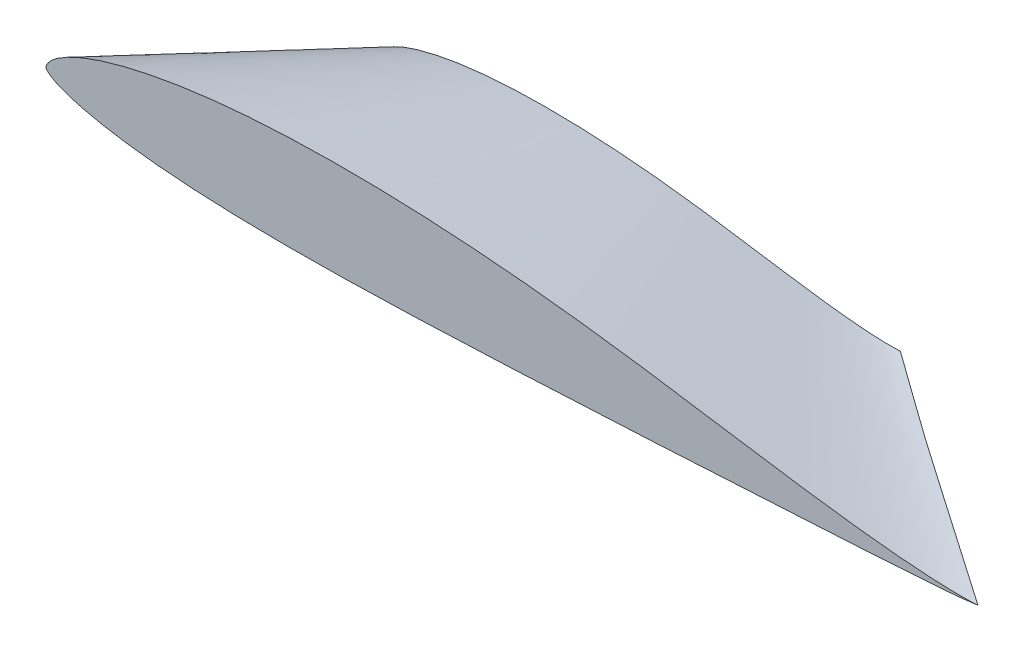
ISO-10303-21;
HEADER;
FILE_DESCRIPTION(('STEP AP214'),'2;1');
FILE_NAME('part.step','',(''),(''),'','','');
FILE_SCHEMA(('AUTOMOTIVE_DESIGN { 1 0 10303 214 1 1 1 1 }'));
ENDSEC;
DATA;
#1=APPLICATION_CONTEXT('core data for automotive mechanical design processes');
#2=APPLICATION_PROTOCOL_DEFINITION('international standard','automotive_design',2000,#1);
#3=PRODUCT_CONTEXT('',#1,'mechanical');
#4=PRODUCT('Part','Part','',(#3));
#5=PRODUCT_RELATED_PRODUCT_CATEGORY('part','',(#4));
#6=PRODUCT_DEFINITION_FORMATION('','',#4);
#7=PRODUCT_DEFINITION_CONTEXT('part definition',#1,'design');
#8=PRODUCT_DEFINITION('design','',#6,#7);
#9=PRODUCT_DEFINITION_SHAPE('','',#8);
#10=(LENGTH_UNIT() NAMED_UNIT(*) SI_UNIT(.MILLI.,.METRE.));
#11=(NAMED_UNIT(*) PLANE_ANGLE_UNIT() SI_UNIT($,.RADIAN.));
#12=(NAMED_UNIT(*) SI_UNIT($,.STERADIAN.) SOLID_ANGLE_UNIT());
#13=UNCERTAINTY_MEASURE_WITH_UNIT(LENGTH_MEASURE(1.E-05),#10,'distance_accuracy_value','');
#14=(GEOMETRIC_REPRESENTATION_CONTEXT(3) GLOBAL_UNCERTAINTY_ASSIGNED_CONTEXT((#13)) GLOBAL_UNIT_ASSIGNED_CONTEXT((#10,
#11,#12)) REPRESENTATION_CONTEXT('',''));
#15=CARTESIAN_POINT('',(0.,0.,0.));
#16=DIRECTION('',(0.,0.,1.));
#17=DIRECTION('',(1.,0.,0.));
#18=AXIS2_PLACEMENT_3D('',#15,#16,#17);
#19=CARTESIAN_POINT('',(30.2126309390007,0.496199434898217,-35.));
#20=DIRECTION('',(0.,0.,-1.));
#21=DIRECTION('',(-1.,0.,0.));
#22=AXIS2_PLACEMENT_3D('',#19,#20,#21);
#23=PLANE('',#22);
#24=CARTESIAN_POINT('',(130.,0.,-35.));
#25=CARTESIAN_POINT('',(130.00284789565,0.00436198396944594,-35.));
#26=CARTESIAN_POINT('',(129.264936884486,-0.0543685600533196,-35.));
#27=CARTESIAN_POINT('',(128.514883284143,-0.0615944404420271,-35.));
#28=CARTESIAN_POINT('',(126.665331110606,-0.0587012388051691,-35.));
#29=CARTESIAN_POINT('',(124.410933682827,0.0581220334944895,-35.));
#30=CARTESIAN_POINT('',(121.493467377831,0.269864385451097,-35.));
#31=CARTESIAN_POINT('',(118.105633906202,0.612549148797999,-35.));
#32=CARTESIAN_POINT('',(114.27710981908,1.08234417076237,-35.));
#33=CARTESIAN_POINT('',(110.100426454593,1.66298451666062,-35.));
#34=CARTESIAN_POINT('',(105.646399101114,2.32926773346608,-35.));
#35=CARTESIAN_POINT('',(100.988713756714,3.05044859428628,-35.));
#36=CARTESIAN_POINT('',(96.1912335998851,3.78738347959371,-35.));
#37=CARTESIAN_POINT('',(91.3034770934868,4.48631205322438,-35.));
#38=CARTESIAN_POINT('',(86.3659618800243,5.1111373225283,-35.));
#39=CARTESIAN_POINT('',(81.4147412229501,5.64233245600475,-35.));
#40=CARTESIAN_POINT('',(76.4865376925869,6.06423980380676,-35.));
#41=CARTESIAN_POINT('',(71.620309212033,6.37124623773558,-35.));
#42=CARTESIAN_POINT('',(66.8566860279294,6.55886386660355,-35.));
#43=CARTESIAN_POINT('',(62.2377738326016,6.62633701613077,-35.));
#44=CARTESIAN_POINT('',(57.8048246655033,6.57328124374517,-35.));
#45=CARTESIAN_POINT('',(53.596729110453,6.39723781459766,-35.));
#46=CARTESIAN_POINT('',(49.6483327049328,6.10107140817271,-35.));
#47=CARTESIAN_POINT('',(45.9901109935646,5.68886435633574,-35.));
#48=CARTESIAN_POINT('',(42.6500380657126,5.17157831450558,-35.));
#49=CARTESIAN_POINT('',(39.6540325132396,4.57049858588213,-35.));
#50=CARTESIAN_POINT('',(37.0277052938856,3.90377983939044,-35.));
#51=CARTESIAN_POINT('',(34.7947185905219,3.1889045347254,-35.));
#52=CARTESIAN_POINT('',(32.9723264209415,2.44661058109185,-35.));
#53=CARTESIAN_POINT('',(31.5754938918139,1.70179811629576,-35.));
#54=CARTESIAN_POINT('',(30.6954271435269,1.05605031948798,-35.));
#55=CARTESIAN_POINT('',(30.2676784454324,0.586361007537532,-35.));
#56=CARTESIAN_POINT('',(30.1050785638683,0.335884265336202,-35.));
#57=CARTESIAN_POINT('',(30.0321517577068,0.175463978344724,-35.));
#58=CARTESIAN_POINT('',(29.9990927415483,0.0475705023075208,-35.));
#59=CARTESIAN_POINT('',(29.9976531894444,-0.0547294381762267,-35.));
#60=CARTESIAN_POINT('',(30.0410130703702,-0.14975181611273,-35.));
#61=CARTESIAN_POINT('',(30.1267998635964,-0.261239222686654,-35.));
#62=CARTESIAN_POINT('',(30.2671091001079,-0.393801006228457,-35.));
#63=CARTESIAN_POINT('',(30.5186271837772,-0.580346826699614,-35.));
#64=CARTESIAN_POINT('',(31.1152712342459,-0.936386608830139,-35.));
#65=CARTESIAN_POINT('',(32.2448776844307,-1.38899131087983,-35.));
#66=CARTESIAN_POINT('',(33.9738438510731,-1.89354833009926,-35.));
#67=CARTESIAN_POINT('',(36.1649829708852,-2.36692774507717,-35.));
#68=CARTESIAN_POINT('',(38.7948587323147,-2.78813354873596,-35.));
#69=CARTESIAN_POINT('',(41.843733542726,-3.13907498168399,-35.));
#70=CARTESIAN_POINT('',(45.2883872085152,-3.40733295579013,-35.));
#71=CARTESIAN_POINT('',(49.1029168523231,-3.59045872977425,-35.));
#72=CARTESIAN_POINT('',(53.2568281178687,-3.68578548605587,-35.));
#73=CARTESIAN_POINT('',(57.715221363267,-3.6980653177991,-35.));
#74=CARTESIAN_POINT('',(62.4381255026303,-3.63283350838669,-35.));
#75=CARTESIAN_POINT('',(67.380381843639,-3.50334491964719,-35.));
#76=CARTESIAN_POINT('',(72.4909150946084,-3.32019326593179,-35.));
#77=CARTESIAN_POINT('',(77.7135132531714,-3.09970731985851,-35.));
#78=CARTESIAN_POINT('',(82.9875907566283,-2.85210491461414,-35.));
#79=CARTESIAN_POINT('',(88.2500745436281,-2.58967771178085,-35.));
#80=CARTESIAN_POINT('',(93.4369687551809,-2.31921217355746,-35.));
#81=CARTESIAN_POINT('',(98.4849063244687,-2.04894048388516,-35.));
#82=CARTESIAN_POINT('',(103.332198378719,-1.7825051981847,-35.));
#83=CARTESIAN_POINT('',(107.919823623481,-1.52559007974668,-35.));
#84=CARTESIAN_POINT('',(112.192125056225,-1.28019715539847,-35.));
#85=CARTESIAN_POINT('',(116.095359878273,-1.05247943629541,-35.));
#86=CARTESIAN_POINT('',(119.584800621069,-0.841798747946817,-35.));
#87=CARTESIAN_POINT('',(122.604348525604,-0.652602906621241,-35.));
#88=CARTESIAN_POINT('',(125.152732101324,-0.477949621519706,-35.));
#89=CARTESIAN_POINT('',(127.100612801097,-0.332466776495842,-35.));
#90=CARTESIAN_POINT('',(128.680616317858,-0.178646187477759,-35.));
#91=CARTESIAN_POINT('',(129.346368718747,-0.0853185747333378,-35.));
#92=CARTESIAN_POINT('',(129.997303555848,-0.0041300130375351,-35.));
#93=CARTESIAN_POINT('',(130.,0.,-35.));
#94=B_SPLINE_CURVE_WITH_KNOTS('',3,(#24,#25,#26,#27,#28,#29,#30,#31,#32,#33,#34,#35,#36,#37,#38,
#39,#40,#41,#42,#43,#44,#45,#46,#47,#48,#49,#50,#51,#52,#53,#54,#55,#56,#57,#58,#59,#60,#61,#62,
#63,#64,#65,#66,#67,#68,#69,#70,#71,#72,#73,#74,#75,#76,#77,#78,#79,#80,#81,#82,#83,#84,#85,#86,
#87,#88,#89,#90,#91,#92,#93),.UNSPECIFIED.,.T.,.F.,(4,1,1,1,1,1,1,1,1,1,1,1,1,1,1,1,1,1,1,1,1,1,
1,1,1,1,1,1,1,1,1,1,1,1,1,1,1,1,1,1,1,1,1,1,1,1,1,1,1,1,1,1,1,1,1,1,1,1,1,1,1,1,1,1,1,1,1,4),
(0.,0.00166889444227927,0.0067468426159481,0.0151872129386612,0.0267420621956626,
0.0411547244136289,0.0581287371473307,0.0772832861456259,0.0982270614239506,0.120580114075382,
0.143965618975972,0.168018430342604,0.192451149867517,0.217074812267772,0.24170960523573,
0.266181697194069,0.290309902402821,0.313902919762404,0.336766570965943,0.358704118492275,
0.379539615222553,0.399121985975392,0.417322023259521,0.434037060269163,0.449154223102326,
0.462553001072433,0.474138703720767,0.483847820074002,0.491647295738643,0.497539457803786,
0.499898001147866,0.501005480813929,0.501950633598752,0.50249156911681,0.5029561863067,
0.50343127816909,0.504003663511862,0.505035338611572,0.506275727387693,0.508636079320926,
0.515300989494995,0.524212720450063,0.535295542817935,0.548466714983409,0.563638125804605,
0.580726427110564,0.599618641918251,0.6201796202389,0.642246244460865,0.665632647569848,
0.69011801784579,0.71545212958592,0.741354375785369,0.767519886202746,0.793633569946153,
0.819375078028979,0.844428817604614,0.868487752174835,0.89125912064447,0.912467268250436,
0.931850462152931,0.949165437969833,0.964196020707947,0.976755393856121,0.986688030230315,
0.993909500787702,0.998419857603063,1.),.UNSPECIFIED.);
#95=CARTESIAN_POINT('',(130.,0.,-35.));
#96=VERTEX_POINT('',#95);
#97=EDGE_CURVE('E57',#96,#96,#94,.T.);
#98=ORIENTED_EDGE('',*,*,#97,.F.);
#99=EDGE_LOOP('',(#98));
#100=FACE_BOUND('',#99,.T.);
#101=ADVANCED_FACE('F47',(#100),#23,.T.);
#102=CARTESIAN_POINT('',(0.382735690201302,0.893158982816775,0.));
#103=DIRECTION('',(0.,0.,-1.));
#104=DIRECTION('',(-1.,0.,0.));
#105=AXIS2_PLACEMENT_3D('',#102,#103,#104);
#106=PLANE('',#105);
#107=CARTESIAN_POINT('',(180.,0.,0.));
#108=CARTESIAN_POINT('',(180.005126212171,0.00785157114500457,0.));
#109=CARTESIAN_POINT('',(178.676886392075,-0.0978634080959786,0.));
#110=CARTESIAN_POINT('',(177.326789911457,-0.110869992795647,0.));
#111=CARTESIAN_POINT('',(173.99759599909,-0.105662229849305,0.));
#112=CARTESIAN_POINT('',(169.939680629088,0.104619660290083,0.));
#113=CARTESIAN_POINT('',(164.688241280096,0.485755893811973,0.));
#114=CARTESIAN_POINT('',(158.590141031164,1.1025884678364,0.));
#115=CARTESIAN_POINT('',(151.698797674345,1.94821950737225,0.));
#116=CARTESIAN_POINT('',(144.180767618267,2.99337212998913,0.));
#117=CARTESIAN_POINT('',(136.163518382006,4.19268192023894,0.));
#118=CARTESIAN_POINT('',(127.779684762085,5.49080746971532,0.));
#119=CARTESIAN_POINT('',(119.144220479793,6.81729026326867,0.));
#120=CARTESIAN_POINT('',(110.346258768276,8.07536169580388,0.));
#121=CARTESIAN_POINT('',(101.458731384044,9.20004718055095,0.));
#122=CARTESIAN_POINT('',(92.5465342013102,10.1561984208086,0.));
#123=CARTESIAN_POINT('',(83.6757678466565,10.9156316468522,0.));
#124=CARTESIAN_POINT('',(74.9165565816595,11.468243227924,0.));
#125=CARTESIAN_POINT('',(66.3420348502729,11.8059549598864,0.));
#126=CARTESIAN_POINT('',(58.0279928986829,11.9274066290354,0.));
#127=CARTESIAN_POINT('',(50.0486843979059,11.8319062387413,0.));
#128=CARTESIAN_POINT('',(42.4741123988154,11.5150280662758,0.));
#129=CARTESIAN_POINT('',(35.366998868879,10.9819285347109,0.));
#130=CARTESIAN_POINT('',(28.7821997884162,10.2399558414043,0.));
#131=CARTESIAN_POINT('',(22.7700685182827,9.30884096611004,0.));
#132=CARTESIAN_POINT('',(17.3772585238312,8.22689745458783,0.));
#133=CARTESIAN_POINT('',(12.6498695289941,7.02680371090279,0.));
#134=CARTESIAN_POINT('',(8.63049346293932,5.74002816250571,0.));
#135=CARTESIAN_POINT('',(5.35018755769472,4.40389904596533,0.));
#136=CARTESIAN_POINT('',(2.83588900526508,3.06323660933236,0.));
#137=CARTESIAN_POINT('',(1.2517688583485,1.90089057507835,0.));
#138=CARTESIAN_POINT('',(0.481821201778291,1.05544981356757,0.));
#139=CARTESIAN_POINT('',(0.189141414962949,0.604591677605163,0.));
#140=CARTESIAN_POINT('',(0.0578731638722663,0.315835161020465,0.));
#141=CARTESIAN_POINT('',(-0.00163306521311235,0.0856269041535623,0.));
#142=CARTESIAN_POINT('',(-0.00422425900007062,-0.0985129887172111,0.));
#143=CARTESIAN_POINT('',(0.0738235266663865,-0.269553269002912,0.));
#144=CARTESIAN_POINT('',(0.22823975447344,-0.470230600835994,0.));
#145=CARTESIAN_POINT('',(0.480796380194107,-0.708841811211186,0.));
#146=CARTESIAN_POINT('',(0.933528930799012,-1.04462428805934,0.));
#147=CARTESIAN_POINT('',(2.00748822164259,-1.68549589589421,0.));
#148=CARTESIAN_POINT('',(4.04077983197539,-2.50018435958373,0.));
#149=CARTESIAN_POINT('',(7.15291893193143,-3.40838699417864,0.));
#150=CARTESIAN_POINT('',(11.0969693475935,-4.26046994113892,0.));
#151=CARTESIAN_POINT('',(15.8307457181665,-5.01864038772472,0.));
#152=CARTESIAN_POINT('',(21.3187203769068,-5.65033496703119,0.));
#153=CARTESIAN_POINT('',(27.5190969753274,-6.13319932042223,0.));
#154=CARTESIAN_POINT('',(34.3852503341817,-6.46282571359366,0.));
#155=CARTESIAN_POINT('',(41.8622906121635,-6.63441387490057,0.));
#156=CARTESIAN_POINT('',(49.8873984538806,-6.65651757203837,0.));
#157=CARTESIAN_POINT('',(58.3886259047346,-6.53910031509604,0.));
#158=CARTESIAN_POINT('',(67.2846873185502,-6.30602085536494,0.));
#159=CARTESIAN_POINT('',(76.4836471702951,-5.97634787867722,0.));
#160=CARTESIAN_POINT('',(85.8843238557086,-5.57947317574531,0.));
#161=CARTESIAN_POINT('',(95.3776633619309,-5.13378884630545,0.));
#162=CARTESIAN_POINT('',(104.850134178531,-4.66141988120554,0.));
#163=CARTESIAN_POINT('',(114.186543759326,-4.17458191240343,0.));
#164=CARTESIAN_POINT('',(123.272831384044,-3.68809287099329,0.));
#165=CARTESIAN_POINT('',(131.997957081694,-3.20850935673246,0.));
#166=CARTESIAN_POINT('',(140.255682522266,-2.74606214354402,0.));
#167=CARTESIAN_POINT('',(147.945825101206,-2.30435487971725,0.));
#168=CARTESIAN_POINT('',(154.971647780892,-1.89446298533174,0.));
#169=CARTESIAN_POINT('',(161.252641117924,-1.51523774630427,0.));
#170=CARTESIAN_POINT('',(166.687827346087,-1.17468523191823,0.));
#171=CARTESIAN_POINT('',(171.274917782383,-0.860309318735472,0.));
#172=CARTESIAN_POINT('',(174.781103041975,-0.598440197692517,0.));
#173=CARTESIAN_POINT('',(177.625109372144,-0.321563137459959,0.));
#174=CARTESIAN_POINT('',(178.823463693745,-0.153573434520018,0.));
#175=CARTESIAN_POINT('',(179.995146400526,-0.00743402346756441,0.));
#176=CARTESIAN_POINT('',(180.,0.,0.));
#177=B_SPLINE_CURVE_WITH_KNOTS('',3,(#107,#108,#109,#110,#111,#112,#113,#114,#115,#116,#117,
#118,#119,#120,#121,#122,#123,#124,#125,#126,#127,#128,#129,#130,#131,#132,#133,#134,#135,#136,
#137,#138,#139,#140,#141,#142,#143,#144,#145,#146,#147,#148,#149,#150,#151,#152,#153,#154,#155,
#156,#157,#158,#159,#160,#161,#162,#163,#164,#165,#166,#167,#168,#169,#170,#171,#172,#173,#174,
#175,#176),.UNSPECIFIED.,.T.,.F.,(4,1,1,1,1,1,1,1,1,1,1,1,1,1,1,1,1,1,1,1,1,1,1,1,1,1,1,1,1,1,1,
1,1,1,1,1,1,1,1,1,1,1,1,1,1,1,1,1,1,1,1,1,1,1,1,1,1,1,1,1,1,1,1,1,1,1,1,4),(0.,
0.00166889444227927,0.00674684261594813,0.0151872129386611,0.0267420621956626,
0.0411547244136289,0.0581287371473307,0.0772832861456259,0.0982270614239506,0.120580114075382,
0.143965618975972,0.168018430342604,0.192451149867517,0.217074812267772,0.24170960523573,
0.266181697194069,0.290309902402822,0.313902919762404,0.336766570965943,0.358704118492275,
0.379539615222553,0.399121985975392,0.417322023259521,0.434037060269163,0.449154223102326,
0.462553001072433,0.474138703720767,0.483847820074002,0.491647295738643,0.497539457803786,
0.499898001147866,0.501005480813929,0.501950633598751,0.50249156911681,0.5029561863067,
0.50343127816909,0.504003663511862,0.505035338611572,0.506275727387693,0.508636079320926,
0.515300989494995,0.524212720450063,0.535295542817935,0.548466714983409,0.563638125804605,
0.580726427110563,0.599618641918251,0.6201796202389,0.642246244460865,0.665632647569848,
0.69011801784579,0.71545212958592,0.741354375785369,0.767519886202747,0.793633569946153,
0.819375078028979,0.844428817604615,0.868487752174835,0.89125912064447,0.912467268250436,
0.931850462152931,0.949165437969833,0.964196020707947,0.976755393856121,0.986688030230315,
0.993909500787702,0.998419857603063,1.),.UNSPECIFIED.);
#178=CARTESIAN_POINT('',(180.,0.,0.));
#179=VERTEX_POINT('',#178);
#180=EDGE_CURVE('E11',#179,#179,#177,.T.);
#181=ORIENTED_EDGE('',*,*,#180,.T.);
#182=EDGE_LOOP('',(#181));
#183=FACE_BOUND('',#182,.T.);
#184=ADVANCED_FACE('F104',(#183),#106,.F.);
#185=CARTESIAN_POINT('',(55.3867719491182,11.8834033679524,0.));
#186=CARTESIAN_POINT('',(61.3985033941447,6.6053351044152,-35.));
#187=CARTESIAN_POINT('',(55.8527687647451,11.8868564004813,0.));
#188=CARTESIAN_POINT('',(61.6573960062719,6.60626019061969,-35.));
#189=CARTESIAN_POINT('',(56.6956212395599,11.8910786304673,0.));
#190=CARTESIAN_POINT('',(62.1256524121765,6.60683583610575,-35.));
#191=CARTESIAN_POINT('',(59.9410456900011,11.8936563582795,0.));
#192=CARTESIAN_POINT('',(63.9286512228044,6.60163664986342,-35.));
#193=CARTESIAN_POINT('',(63.0972156415212,11.8533553352134,0.));
#194=CARTESIAN_POINT('',(65.6819924559399,6.57312671964915,-35.));
#195=CARTESIAN_POINT('',(68.3661579940879,11.720868986189,0.));
#196=CARTESIAN_POINT('',(68.6089176917924,6.48985136555216,-35.));
#197=CARTESIAN_POINT('',(71.6089238724772,11.5985159598508,0.));
#198=CARTESIAN_POINT('',(70.4102299376179,6.41613529285492,-35.));
#199=CARTESIAN_POINT('',(77.0265883379338,11.3300299076205,0.));
#200=CARTESIAN_POINT('',(73.4195661398297,6.25773256789209,-35.));
#201=CARTESIAN_POINT('',(80.3304472992273,11.1266852247347,0.));
#202=CARTESIAN_POINT('',(75.2547021243875,6.13932317012653,-35.));
#203=CARTESIAN_POINT('',(85.847005896518,10.7249445328782,0.));
#204=CARTESIAN_POINT('',(78.3188033016457,5.90737811600835,-35.));
#205=CARTESIAN_POINT('',(89.1870945139726,10.4438026725106,0.));
#206=CARTESIAN_POINT('',(80.1739663458902,5.74602271761489,-35.));
#207=CARTESIAN_POINT('',(94.7547363304433,9.91469325592911,0.));
#208=CARTESIAN_POINT('',(83.266287375914,5.44368804607399,-35.));
#209=CARTESIAN_POINT('',(98.10762719603,9.55957271167469,0.));
#210=CARTESIAN_POINT('',(85.1284973736436,5.24164701405674,-35.));
#211=CARTESIAN_POINT('',(103.681588986936,8.91469029872754,0.));
#212=CARTESIAN_POINT('',(88.2242707265811,4.87597484194822,-35.));
#213=CARTESIAN_POINT('',(107.025673920947,8.49557008641747,0.));
#214=CARTESIAN_POINT('',(90.0815758466374,4.63901273600111,-35.));
#215=CARTESIAN_POINT('',(112.562901544963,7.75493946610446,0.));
#216=CARTESIAN_POINT('',(93.1569582382284,4.22127206380392,-35.));
#217=CARTESIAN_POINT('',(115.876650643504,7.28453897378169,0.));
#218=CARTESIAN_POINT('',(94.9974901238537,3.95683668381612,-35.));
#219=CARTESIAN_POINT('',(121.334596115852,6.47861218989027,0.));
#220=CARTESIAN_POINT('',(98.029076537922,3.50507474032203,-35.));
#221=CARTESIAN_POINT('',(124.597392632315,5.97963535623162,0.));
#222=CARTESIAN_POINT('',(99.8415353630342,3.22651980496333,-35.));
#223=CARTESIAN_POINT('',(129.924247428882,5.15849498392901,0.));
#224=CARTESIAN_POINT('',(102.80081822632,2.76986822771905,-35.));
#225=CARTESIAN_POINT('',(133.10591739427,4.66611091969486,0.));
#226=CARTESIAN_POINT('',(104.568491604727,2.49679638554917,-35.));
#227=CARTESIAN_POINT('',(138.229918356279,3.88465376302119,0.));
#228=CARTESIAN_POINT('',(107.415490827314,2.06462721094302,-35.));
#229=CARTESIAN_POINT('',(141.289972848531,3.42580953673286,0.));
#230=CARTESIAN_POINT('',(109.115773737781,1.81156836730633,-35.));
#231=CARTESIAN_POINT('',(146.125567639943,2.72519514724775,0.));
#232=CARTESIAN_POINT('',(111.802700236376,1.42633530214938,-35.));
#233=CARTESIAN_POINT('',(149.019747564055,2.32065965831682,0.));
#234=CARTESIAN_POINT('',(113.411100337869,1.20477014721966,-35.));
#235=CARTESIAN_POINT('',(153.479700678381,1.73306451992681,0.));
#236=CARTESIAN_POINT('',(115.890013330957,0.884426115776823,-35.));
#237=CARTESIAN_POINT('',(156.166253706104,1.40002167530821,0.));
#238=CARTESIAN_POINT('',(117.382794913009,0.704007468648969,-35.));
#239=CARTESIAN_POINT('',(160.15302696673,0.948983624796099,0.));
#240=CARTESIAN_POINT('',(119.597380644746,0.461656585054128,-35.));
#241=CARTESIAN_POINT('',(162.575234085591,0.699489944338048,0.));
#242=CARTESIAN_POINT('',(120.944766602512,0.329215379017822,-35.));
#243=CARTESIAN_POINT('',(166.008656714401,0.395886817440324,0.));
#244=CARTESIAN_POINT('',(122.85730475513,0.170880505684869,-35.));
#245=CARTESIAN_POINT('',(168.147498039969,0.23469175603494,0.));
#246=CARTESIAN_POINT('',(124.042062080572,0.0877371330906659,-35.));
#247=CARTESIAN_POINT('',(170.900623314212,0.0592644794975592,0.));
#248=CARTESIAN_POINT('',(125.55835975479,-0.00133778791810761,-35.));
#249=CARTESIAN_POINT('',(172.636575103362,-0.0351338869990303,0.));
#250=CARTESIAN_POINT('',(126.537278686234,-0.0436426453176784,-35.));
#251=CARTESIAN_POINT('',(174.735166131116,-0.0962115578665499,0.));
#252=CARTESIAN_POINT('',(127.746363573718,-0.0603922670100089,-35.));
#253=CARTESIAN_POINT('',(176.240928900985,-0.10917141143209,0.));
#254=CARTESIAN_POINT('',(128.533135662994,-0.060159410517532,-35.));
#255=CARTESIAN_POINT('',(177.443657202324,-0.106955700746182,0.));
#256=CARTESIAN_POINT('',(129.08482961624,-0.0561036808192062,-35.));
#257=CARTESIAN_POINT('',(178.111324254622,-0.102823970835839,0.));
#258=CARTESIAN_POINT('',(129.603987943501,-0.027383391318669,-35.));
#259=CARTESIAN_POINT('',(178.692575160899,-0.0829879503397252,0.));
#260=CARTESIAN_POINT('',(130.159369784277,0.0168196049175308,-35.));
#261=CARTESIAN_POINT('',(179.171022704869,-0.0541920731710484,0.));
#262=CARTESIAN_POINT('',(129.844351157361,-0.0232071687423143,-35.));
#263=CARTESIAN_POINT('',(179.705914343305,-0.0159627852891748,0.));
#264=CARTESIAN_POINT('',(129.5544540319,-0.0599280142864187,-35.));
#265=CARTESIAN_POINT('',(180.287534726532,0.0290344312716896,0.));
#266=CARTESIAN_POINT('',(129.301246405011,-0.0927880378005718,-35.));
#267=CARTESIAN_POINT('',(179.419837860025,-0.079190012350651,0.));
#268=CARTESIAN_POINT('',(129.027092616461,-0.128821435556947,-35.));
#269=CARTESIAN_POINT('',(178.554256527721,-0.191311882184757,0.));
#270=CARTESIAN_POINT('',(128.685612530917,-0.171664494633701,-35.));
#271=CARTESIAN_POINT('',(177.734403331824,-0.300407627010932,0.));
#272=CARTESIAN_POINT('',(128.125588015699,-0.232680738321548,-35.));
#273=CARTESIAN_POINT('',(176.49196469899,-0.431879968541873,0.));
#274=CARTESIAN_POINT('',(127.386592945466,-0.301853671169864,-35.));
#275=CARTESIAN_POINT('',(174.69183568801,-0.59809929384676,0.));
#276=CARTESIAN_POINT('',(126.423984104752,-0.383002657764437,-35.));
#277=CARTESIAN_POINT('',(173.122720973259,-0.7223010386164,0.));
#278=CARTESIAN_POINT('',(125.565383619685,-0.446378997076988,-35.));
#279=CARTESIAN_POINT('',(170.809437198704,-0.890644014530881,0.));
#280=CARTESIAN_POINT('',(124.267607847342,-0.538611548614921,-35.));
#281=CARTESIAN_POINT('',(168.904268633005,-1.02278158770895,0.));
#282=CARTESIAN_POINT('',(123.205270070417,-0.610723356797999,-35.));
#283=CARTESIAN_POINT('',(165.920571197772,-1.22129537808459,0.));
#284=CARTESIAN_POINT('',(121.551363350485,-0.718579808597432,-35.));
#285=CARTESIAN_POINT('',(163.723621279676,-1.36041351917435,0.));
#286=CARTESIAN_POINT('',(120.331835547312,-0.794724479788975,-35.));
#287=CARTESIAN_POINT('',(160.179665219397,-1.57948038417206,0.));
#288=CARTESIAN_POINT('',(118.361774913155,-0.915640924101637,-35.));
#289=CARTESIAN_POINT('',(157.701595525274,-1.72963792815614,0.));
#290=CARTESIAN_POINT('',(116.98473908217,-0.998545059038378,-35.));
#291=CARTESIAN_POINT('',(153.623230876204,-1.97266117977059,0.));
#292=CARTESIAN_POINT('',(114.719267455601,-1.13276172574308,-35.));
#293=CARTESIAN_POINT('',(150.895153302915,-2.13228880590949,0.));
#294=CARTESIAN_POINT('',(113.203730174535,-1.22107483031662,-35.));
#295=CARTESIAN_POINT('',(146.345753163521,-2.39605667214286,0.));
#296=CARTESIAN_POINT('',(110.676170616277,-1.3672707149433,-35.));
#297=CARTESIAN_POINT('',(143.395613126649,-2.56571046064208,0.));
#298=CARTESIAN_POINT('',(109.037165206354,-1.46124614818862,-35.));
#299=CARTESIAN_POINT('',(138.434163256059,-2.84775254090119,0.));
#300=CARTESIAN_POINT('',(106.280799357822,-1.61737833420698,-35.));
#301=CARTESIAN_POINT('',(135.294196528699,-3.02391412439645,0.));
#302=CARTESIAN_POINT('',(104.536363054889,-1.71495021168522,-35.));
#303=CARTESIAN_POINT('',(129.986544452965,-3.31884221378586,0.));
#304=CARTESIAN_POINT('',(101.587637635497,-1.87839637512225,-35.));
#305=CARTESIAN_POINT('',(126.69006986578,-3.50026162397986,0.));
#306=CARTESIAN_POINT('',(99.7562452966092,-1.97889560684128,-35.));
#307=CARTESIAN_POINT('',(121.104982217467,-3.8038543889788,0.));
#308=CARTESIAN_POINT('',(96.6533906753438,-2.14700168657553,-35.));
#309=CARTESIAN_POINT('',(117.687513647185,-3.98713643905991,0.));
#310=CARTESIAN_POINT('',(94.7547796861676,-2.24849335989413,-35.));
#311=CARTESIAN_POINT('',(111.897765729824,-4.29362952665636,0.));
#312=CARTESIAN_POINT('',(91.5382234967051,-2.41822039260673,-35.));
#313=CARTESIAN_POINT('',(108.396548253102,-4.47649557923972,0.));
#314=CARTESIAN_POINT('',(89.5930802667283,-2.51938324223422,-35.));
#315=CARTESIAN_POINT('',(102.477580795406,-4.77925068197441,0.));
#316=CARTESIAN_POINT('',(86.3047194736387,-2.68668781389195,-35.));
#317=CARTESIAN_POINT('',(98.9307804882978,-4.95660358045913,0.));
#318=CARTESIAN_POINT('',(84.3342445540783,-2.78460929483966,-35.));
#319=CARTESIAN_POINT('',(92.9595739971753,-5.24669570199926,0.));
#320=CARTESIAN_POINT('',(81.0168515183959,-2.94462531750469,-35.));
#321=CARTESIAN_POINT('',(89.4059802531505,-5.4141417800881,0.));
#322=CARTESIAN_POINT('',(79.0425910899411,-3.03675501250432,-35.));
#323=CARTESIAN_POINT('',(83.4594113465495,-5.68085572404515,0.));
#324=CARTESIAN_POINT('',(75.7388580664824,-3.18307266863453,-35.));
#325=CARTESIAN_POINT('',(79.9370507763253,-5.83055321132377,0.));
#326=CARTESIAN_POINT('',(73.7819361788161,-3.26493382406015,-35.));
#327=CARTESIAN_POINT('',(74.0900911410062,-6.06079532726675,0.));
#328=CARTESIAN_POINT('',(70.5335252272165,-3.39034234305805,-35.));
#329=CARTESIAN_POINT('',(70.6358616728035,-6.18592123078003,0.));
#330=CARTESIAN_POINT('',(68.6144425766474,-3.45796734397307,-35.));
#331=CARTESIAN_POINT('',(64.9594244173419,-6.36493371319966,0.));
#332=CARTESIAN_POINT('',(65.4607456176159,-3.55363996074783,-35.));
#333=CARTESIAN_POINT('',(61.6072833702927,-6.45477053046048,0.));
#334=CARTESIAN_POINT('',(63.5983776896923,-3.60094013394242,-35.));
#335=CARTESIAN_POINT('',(56.1659280720261,-6.56721765899219,0.));
#336=CARTESIAN_POINT('',(60.5752995884573,-3.65856248814494,-35.));
#337=CARTESIAN_POINT('',(52.9464790733133,-6.61426616103029,0.));
#338=CARTESIAN_POINT('',(58.7866726464226,-3.68124555998617,-35.));
#339=CARTESIAN_POINT('',(47.7980798955365,-6.64730663175602,0.));
#340=CARTESIAN_POINT('',(55.926407011731,-3.69313835464272,-35.));
#341=CARTESIAN_POINT('',(44.738678748018,-6.64233636185772,0.));
#342=CARTESIAN_POINT('',(54.2267551625639,-3.6859614137573,-35.));
#343=CARTESIAN_POINT('',(39.9339295162153,-6.58593630722026,0.));
#344=CARTESIAN_POINT('',(51.5575395248555,-3.64678906576594,-35.));
#345=CARTESIAN_POINT('',(37.0581561228324,-6.52416535770013,0.));
#346=CARTESIAN_POINT('',(49.9600208833882,-3.60698512291485,-35.));
#347=CARTESIAN_POINT('',(32.6414936502236,-6.37384956139218,0.));
#348=CARTESIAN_POINT('',(47.5066466421849,-3.51382589558095,-35.));
#349=CARTESIAN_POINT('',(29.9706765489155,-6.25089336105599,0.));
#350=CARTESIAN_POINT('',(46.0231906767303,-3.43879770932302,-35.));
#351=CARTESIAN_POINT('',(25.9809951501344,-6.00710810813844,0.));
#352=CARTESIAN_POINT('',(43.8073958188944,-3.29199835661286,-35.));
#353=CARTESIAN_POINT('',(23.5334879303282,-5.82281357145446,0.));
#354=CARTESIAN_POINT('',(42.4483318830809,-3.18131213083207,-35.));
#355=CARTESIAN_POINT('',(20.0041632854862,-5.49109927024696,0.));
#356=CARTESIAN_POINT('',(40.4888930135937,-2.98312575245158,-35.));
#357=CARTESIAN_POINT('',(17.7962760374091,-5.24488320503632,0.));
#358=CARTESIAN_POINT('',(39.2635048751615,-2.83607079909251,-35.));
#359=CARTESIAN_POINT('',(14.7548533409814,-4.8366370956797,0.));
#360=CARTESIAN_POINT('',(37.5760623747049,-2.59292885244094,-35.));
#361=CARTESIAN_POINT('',(12.7998892994628,-4.53321277462693,0.));
#362=CARTESIAN_POINT('',(36.4920205071603,-2.41162883139665,-35.));
#363=CARTESIAN_POINT('',(10.2700454346004,-4.06965630445478,0.));
#364=CARTESIAN_POINT('',(35.0900056764056,-2.13468684436296,-35.));
#365=CARTESIAN_POINT('',(8.58134758123516,-3.71698844820364,0.));
#366=CARTESIAN_POINT('',(34.1556645513267,-1.92202195686871,-35.));
#367=CARTESIAN_POINT('',(6.58697905457373,-3.22644764125897,0.));
#368=CARTESIAN_POINT('',(33.0540346425068,-1.62512422702611,-35.));
#369=CARTESIAN_POINT('',(5.18070370031867,-2.8328436100914,0.));
#370=CARTESIAN_POINT('',(32.2795168118428,-1.38271308053687,-35.));
#371=CARTESIAN_POINT('',(3.73995221137293,-2.3549565738306,0.));
#372=CARTESIAN_POINT('',(31.4884226467035,-1.08589893130949,-35.));
#373=CARTESIAN_POINT('',(2.71080178815633,-1.96542539101367,0.));
#374=CARTESIAN_POINT('',(30.9350978992165,-0.828870452590582,-35.));
#375=CARTESIAN_POINT('',(1.97524413984532,-1.62457083713395,0.));
#376=CARTESIAN_POINT('',(30.5477304495122,-0.597713832007781,-35.));
#377=CARTESIAN_POINT('',(1.58773594787939,-1.42081794508248,0.));
#378=CARTESIAN_POINT('',(30.3503119695812,-0.455510873467514,-35.));
#379=CARTESIAN_POINT('',(1.34594803032872,-1.28693872438188,0.));
#380=CARTESIAN_POINT('',(30.2306241965527,-0.359330689035682,-35.));
#381=CARTESIAN_POINT('',(1.12572932409457,-1.15621503384097,0.));
#382=CARTESIAN_POINT('',(30.1267998635964,-0.261239222686654,-35.));
#383=CARTESIAN_POINT('',(0.935880592713854,-1.03333868444174,0.));
#384=CARTESIAN_POINT('',(30.050071437741,-0.161523953151339,-35.));
#385=CARTESIAN_POINT('',(0.830512807218195,-0.96178832241928,0.));
#386=CARTESIAN_POINT('',(30.0172716876652,-0.0977230145579637,-35.));
#387=CARTESIAN_POINT('',(0.736839332575508,-0.896352410978544,0.));
#388=CARTESIAN_POINT('',(29.9979016479003,-0.0370730538158241,-35.));
#389=CARTESIAN_POINT('',(0.616620624029479,-0.808372943587431,0.));
#390=CARTESIAN_POINT('',(29.9990927415483,0.0475705023075208,-35.));
#391=CARTESIAN_POINT('',(0.519553217144352,-0.730934489257493,0.));
#392=CARTESIAN_POINT('',(30.0163932620747,0.11450001094054,-35.));
#393=CARTESIAN_POINT('',(0.381481001212177,-0.614079033951335,0.));
#394=CARTESIAN_POINT('',(30.0477920318991,0.20986857394708,-35.));
#395=CARTESIAN_POINT('',(0.288101728345487,-0.526787177010936,0.));
#396=CARTESIAN_POINT('',(30.0772992889116,0.274587387395292,-35.));
#397=CARTESIAN_POINT('',(0.159180295331338,-0.380481821220749,0.));
#398=CARTESIAN_POINT('',(30.1295556991695,0.369654746512549,-35.));
#399=CARTESIAN_POINT('',(0.0769290663060759,-0.273589188139425,0.));
#400=CARTESIAN_POINT('',(30.1686977580727,0.433485867094063,-35.));
#401=CARTESIAN_POINT('',(0.0219155763655663,-0.155797954964269,0.));
#402=CARTESIAN_POINT('',(30.209111430547,0.491620882680695,-35.));
#403=CARTESIAN_POINT('',(-0.00346600495972977,-0.0446286291374915,0.));
#404=CARTESIAN_POINT('',(30.2465068369255,0.542925654603435,-35.));
#405=CARTESIAN_POINT('',(-0.00163306521311235,0.0856269041535623,0.));
#406=CARTESIAN_POINT('',(30.2895268598868,0.59910591745782,-35.));
#407=CARTESIAN_POINT('',(0.0578731638722663,0.315835161020465,0.));
#408=CARTESIAN_POINT('',(30.3740487327948,0.700302847772476,-35.));
#409=CARTESIAN_POINT('',(0.151614070575236,0.522041135855473,0.));
#410=CARTESIAN_POINT('',(30.4595561478673,0.791999747266366,-35.));
#411=CARTESIAN_POINT('',(0.276137415632528,0.738604535564559,0.));
#412=CARTESIAN_POINT('',(30.557901573699,0.890086000011374,-35.));
#413=CARTESIAN_POINT('',(0.511935861548222,1.08851720544969,0.));
#414=CARTESIAN_POINT('',(30.7282098579974,1.05107949513629,-35.));
#415=CARTESIAN_POINT('',(0.996715371430908,1.62082918081923,0.));
#416=CARTESIAN_POINT('',(31.0362025993986,1.30408432942218,-35.));
#417=CARTESIAN_POINT('',(1.76013298043932,2.2739020681898,0.));
#418=CARTESIAN_POINT('',(31.4976850455599,1.62033508041473,-35.));
#419=CARTESIAN_POINT('',(2.82439981577568,3.00826690327222,0.));
#420=CARTESIAN_POINT('',(32.1122519994354,1.98800574734693,-35.));
#421=CARTESIAN_POINT('',(3.97390957159602,3.67004657783087,0.));
#422=CARTESIAN_POINT('',(32.7685456372293,2.32273329377568,-35.));
#423=CARTESIAN_POINT('',(5.54254929030124,4.45157321596638,0.));
#424=CARTESIAN_POINT('',(33.6550416862542,2.7246931046859,-35.));
#425=CARTESIAN_POINT('',(6.97471875969548,5.06560057698754,0.));
#426=CARTESIAN_POINT('',(34.4605897384163,3.04234514273386,-35.));
#427=CARTESIAN_POINT('',(9.0436775759687,5.85129347112685,0.));
#428=CARTESIAN_POINT('',(35.6191527510946,3.45284144972266,-35.));
#429=CARTESIAN_POINT('',(10.7384276758271,6.41486877413229,0.));
#430=CARTESIAN_POINT('',(36.5664264195184,3.74819457120394,-35.));
#431=CARTESIAN_POINT('',(13.2889229766861,7.17331349096654,0.));
#432=CARTESIAN_POINT('',(37.9894978110634,4.1479402382594,-35.));
#433=CARTESIAN_POINT('',(15.2297252140228,7.68172520574796,0.));
#434=CARTESIAN_POINT('',(39.071370121808,4.41625978518709,-35.));
#435=CARTESIAN_POINT('',(18.2382160051069,8.38720105983473,0.));
#436=CARTESIAN_POINT('',(40.7468771253815,4.7897527666201,-35.));
#437=CARTESIAN_POINT('',(20.4075564792295,8.8348571665368,0.));
#438=CARTESIAN_POINT('',(41.9544673850638,5.02660908744685,-35.));
#439=CARTESIAN_POINT('',(23.8434086767703,9.46454510560175,0.));
#440=CARTESIAN_POINT('',(43.8661870107204,5.35992655947746,-35.));
#441=CARTESIAN_POINT('',(26.222677617129,9.84355578620758,0.));
#442=CARTESIAN_POINT('',(45.1896550469708,5.55991274232136,-35.));
#443=CARTESIAN_POINT('',(30.0539600931574,10.3736688623647,0.));
#444=CARTESIAN_POINT('',(47.3202246995362,5.83874107038035,-35.));
#445=CARTESIAN_POINT('',(32.6263409546902,10.673112227763,0.));
#446=CARTESIAN_POINT('',(48.7504262056253,5.99546116351653,-35.));
#447=CARTESIAN_POINT('',(36.8227166843231,11.0826500545212,0.));
#448=CARTESIAN_POINT('',(51.0830648227127,6.2086896439991,-35.));
#449=CARTESIAN_POINT('',(39.5720589507,11.2973471009655,0.));
#450=CARTESIAN_POINT('',(52.6111301572181,6.31941383385503,-35.));
#451=CARTESIAN_POINT('',(44.1001458739112,11.575668127124,0.));
#452=CARTESIAN_POINT('',(55.1274635867572,6.46127527353785,-35.));
#453=CARTESIAN_POINT('',(47.0072692075288,11.7046702592891,0.));
#454=CARTESIAN_POINT('',(56.742856318275,6.52535526404821,-35.));
#455=CARTESIAN_POINT('',(51.362247985762,11.8329034844018,0.));
#456=CARTESIAN_POINT('',(59.1625592048787,6.58612854971508,-35.));
#457=CARTESIAN_POINT('',(53.5628510198893,11.8698881290329,0.));
#458=CARTESIAN_POINT('',(60.3851924919099,6.60171429836432,-35.));
#459=CARTESIAN_POINT('',(55.3867719491182,11.8834033679524,0.));
#460=CARTESIAN_POINT('',(61.3985033941447,6.6053351044152,-35.));
#461=B_SPLINE_SURFACE_WITH_KNOTS('',3,1,((#185,#186),(#187,#188),(#189,#190),(#191,#192),(#193,
#194),(#195,#196),(#197,#198),(#199,#200),(#201,#202),(#203,#204),(#205,#206),(#207,#208),(#209,
#210),(#211,#212),(#213,#214),(#215,#216),(#217,#218),(#219,#220),(#221,#222),(#223,#224),(#225,
#226),(#227,#228),(#229,#230),(#231,#232),(#233,#234),(#235,#236),(#237,#238),(#239,#240),(#241,
#242),(#243,#244),(#245,#246),(#247,#248),(#249,#250),(#251,#252),(#253,#254),(#255,#256),(#257,
#258),(#259,#260),(#261,#262),(#263,#264),(#265,#266),(#267,#268),(#269,#270),(#271,#272),(#273,
#274),(#275,#276),(#277,#278),(#279,#280),(#281,#282),(#283,#284),(#285,#286),(#287,#288),(#289,
#290),(#291,#292),(#293,#294),(#295,#296),(#297,#298),(#299,#300),(#301,#302),(#303,#304),(#305,
#306),(#307,#308),(#309,#310),(#311,#312),(#313,#314),(#315,#316),(#317,#318),(#319,#320),(#321,
#322),(#323,#324),(#325,#326),(#327,#328),(#329,#330),(#331,#332),(#333,#334),(#335,#336),(#337,
#338),(#339,#340),(#341,#342),(#343,#344),(#345,#346),(#347,#348),(#349,#350),(#351,#352),(#353,
#354),(#355,#356),(#357,#358),(#359,#360),(#361,#362),(#363,#364),(#365,#366),(#367,#368),(#369,
#370),(#371,#372),(#373,#374),(#375,#376),(#377,#378),(#379,#380),(#381,#382),(#383,#384),(#385,
#386),(#387,#388),(#389,#390),(#391,#392),(#393,#394),(#395,#396),(#397,#398),(#399,#400),(#401,
#402),(#403,#404),(#405,#406),(#407,#408),(#409,#410),(#411,#412),(#413,#414),(#415,#416),(#417,
#418),(#419,#420),(#421,#422),(#423,#424),(#425,#426),(#427,#428),(#429,#430),(#431,#432),(#433,
#434),(#435,#436),(#437,#438),(#439,#440),(#441,#442),(#443,#444),(#445,#446),(#447,#448),(#449,
#450),(#451,#452),(#453,#454),(#455,#456),(#457,#458),(#459,#460)),.UNSPECIFIED.,.T.,.F.,.F.,(4,
1,1,1,1,1,1,1,1,1,1,1,1,1,1,1,1,1,1,1,1,1,1,1,1,1,1,1,1,1,1,1,1,1,1,1,1,1,1,1,1,1,1,1,1,1,1,1,1,
1,1,1,1,1,1,1,1,1,1,1,1,1,1,1,1,1,1,1,1,1,1,1,1,1,1,1,1,1,1,1,1,1,1,1,1,1,1,1,1,1,1,1,1,1,1,1,1,
1,1,1,1,1,1,1,1,1,1,1,1,1,1,1,1,1,1,1,1,1,1,1,1,1,1,1,1,1,1,1,1,1,1,1,1,1,1,4),(2,2),(0.,
0.00383342903107886,0.00693342903017513,0.0266970802346178,0.0297970802337139,
0.0502900975942004,0.0533900975932967,0.0744183028029528,0.077518302802049,0.0988903947612922,
0.101990394760388,0.12352518772925,0.126625187728346,0.148148850129505,0.151248850128601,
0.172581569654418,0.175681569653514,0.19663438102105,0.199734381020147,0.22001988592164,
0.223119885920736,0.242372938573071,0.245472938572168,0.263316713851396,0.266416713850492,
0.282471262849691,0.285571262848788,0.299445275583393,0.302545275582489,0.313857937801359,
0.316957937800456,0.325412787058361,0.328512787057457,0.333853157381074,0.33695315738017,
0.338931105554743,0.340599999997022,0.342031105553839,0.342180142393959,0.343699999996118,
0.345280142393055,0.34669049920932,0.349790499208416,0.353911969766707,0.357011969765803,
0.363844606140901,0.366944606139997,0.376403979289075,0.379503979288171,0.391434562027189,
0.394534562026285,0.408749537844091,0.411849537843187,0.428132731746586,0.431232731745682,
0.449340879352552,0.452440879351648,0.472112247822187,0.475212247821284,0.496171182392408,
0.499271182391504,0.521224921968043,0.524324921967139,0.546966430050869,0.550066430049965,
0.573080113794275,0.576180113793372,0.599245624211653,0.602345624210749,0.625147870411102,
0.628247870410198,0.650481982151232,0.653581982150328,0.674967352427174,0.67806735242627,
0.698353755536157,0.701453755535253,0.720420379758122,0.723520379757218,0.740981358078771,
0.744081358077867,0.759873572886458,0.762973572885555,0.776961874192417,0.780061874191513,
0.792133285013613,0.795233285012709,0.805304457179087,0.808404457178184,0.816387279546959,
0.819487279546055,0.825299010502027,0.828399010501123,0.831963920676096,0.834324272609329,
0.835063920675192,0.83556466138545,0.83659633648516,0.837168721827932,0.837424272608426,
0.837643813690322,0.838108430880212,0.83864936639827,0.838664661384546,0.839594519183093,
0.839696336484256,0.840268721827029,0.840701998849156,0.840743813689419,0.841208430879308,
0.841749366397367,0.842694519182189,0.843060542193236,0.843801998848252,0.846160542192332,
0.848952704258379,0.852052704257475,0.85675217992302,0.859852179922116,0.866461296276254,
0.869561296275351,0.878046998924589,0.881146998923685,0.891445776894696,0.894545776893792,
0.906562939727859,0.909662939726955,0.923277976737501,0.926377976736597,0.94147801402163,
0.944578014020726,0.961060384774469,0.964160384773565,0.981895881504747,0.984995881503843,1.),
(0.,1.),.UNSPECIFIED.);
#462=ORIENTED_EDGE('',*,*,#180,.F.);
#463=EDGE_LOOP('',(#462));
#464=FACE_BOUND('',#463,.T.);
#465=ORIENTED_EDGE('',*,*,#97,.T.);
#466=EDGE_LOOP('',(#465));
#467=FACE_BOUND('',#466,.T.);
#468=ADVANCED_FACE('F87',(#464,#467),#461,.T.);
#469=CLOSED_SHELL('',(#101,#184,#468));
#470=MANIFOLD_SOLID_BREP('B2',#469);
#471=ADVANCED_BREP_SHAPE_REPRESENTATION('',(#18,#470),#14);
#472=SHAPE_DEFINITION_REPRESENTATION(#9,#471);
ENDSEC;
END-ISO-10303-21;
